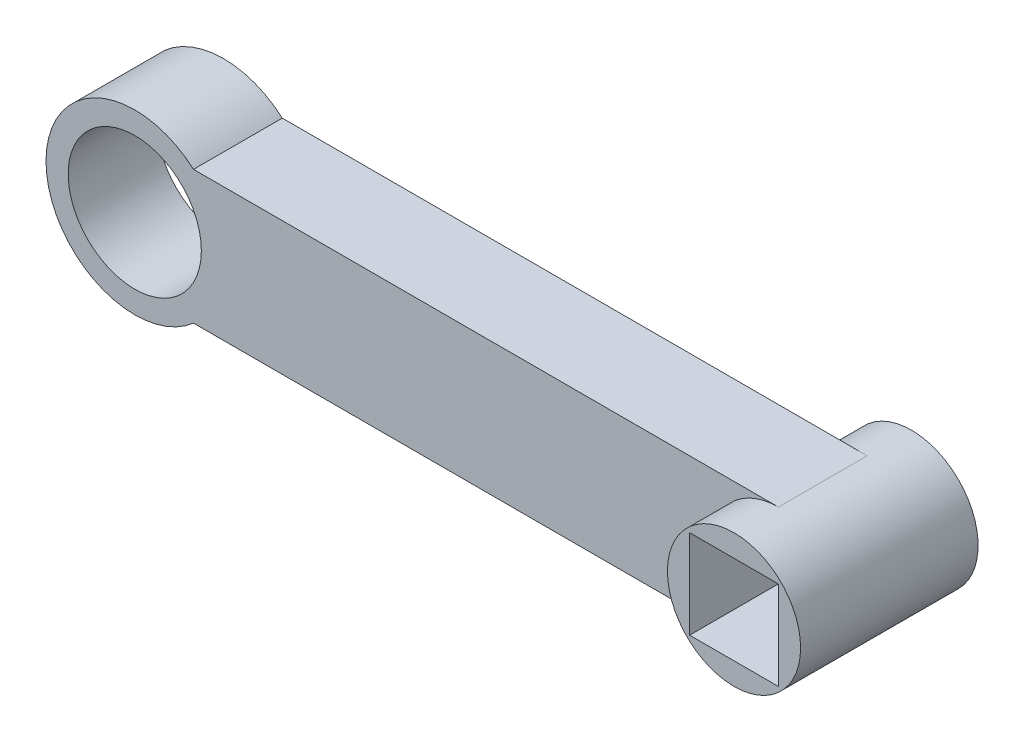
ISO-10303-21;
HEADER;
FILE_DESCRIPTION(('STEP AP214'),'2;1');
FILE_NAME('part.step','',(''),(''),'','','');
FILE_SCHEMA(('AUTOMOTIVE_DESIGN { 1 0 10303 214 1 1 1 1 }'));
ENDSEC;
DATA;
#1=APPLICATION_CONTEXT('core data for automotive mechanical design processes');
#2=APPLICATION_PROTOCOL_DEFINITION('international standard','automotive_design',2000,#1);
#3=PRODUCT_CONTEXT('',#1,'mechanical');
#4=PRODUCT('Part','Part','',(#3));
#5=PRODUCT_RELATED_PRODUCT_CATEGORY('part','',(#4));
#6=PRODUCT_DEFINITION_FORMATION('','',#4);
#7=PRODUCT_DEFINITION_CONTEXT('part definition',#1,'design');
#8=PRODUCT_DEFINITION('design','',#6,#7);
#9=PRODUCT_DEFINITION_SHAPE('','',#8);
#10=(LENGTH_UNIT() NAMED_UNIT(*) SI_UNIT(.MILLI.,.METRE.));
#11=(NAMED_UNIT(*) PLANE_ANGLE_UNIT() SI_UNIT($,.RADIAN.));
#12=(NAMED_UNIT(*) SI_UNIT($,.STERADIAN.) SOLID_ANGLE_UNIT());
#13=UNCERTAINTY_MEASURE_WITH_UNIT(LENGTH_MEASURE(1.E-05),#10,'distance_accuracy_value','');
#14=(GEOMETRIC_REPRESENTATION_CONTEXT(3) GLOBAL_UNCERTAINTY_ASSIGNED_CONTEXT((#13)) GLOBAL_UNIT_ASSIGNED_CONTEXT((#10,
#11,#12)) REPRESENTATION_CONTEXT('',''));
#15=CARTESIAN_POINT('',(0.,0.,0.));
#16=DIRECTION('',(0.,0.,1.));
#17=DIRECTION('',(1.,0.,0.));
#18=AXIS2_PLACEMENT_3D('',#15,#16,#17);
#19=CARTESIAN_POINT('',(72.5,0.,0.));
#20=DIRECTION('',(0.,0.,1.));
#21=DIRECTION('',(1.,0.,0.));
#22=AXIS2_PLACEMENT_3D('',#19,#20,#21);
#23=PLANE('',#22);
#24=CARTESIAN_POINT('',(-72.5,0.,0.));
#25=DIRECTION('',(0.,0.,1.));
#26=DIRECTION('',(1.,0.,0.));
#27=AXIS2_PLACEMENT_3D('',#24,#25,#26);
#28=CIRCLE('',#27,15.);
#29=CARTESIAN_POINT('',(-57.5,0.,0.));
#30=VERTEX_POINT('',#29);
#31=EDGE_CURVE('E146',#30,#30,#28,.T.);
#32=ORIENTED_EDGE('',*,*,#31,.T.);
#33=EDGE_LOOP('',(#32));
#34=FACE_BOUND('',#33,.T.);
#35=CARTESIAN_POINT('',(72.5,0.,0.));
#36=DIRECTION('',(0.,0.,-1.));
#37=DIRECTION('',(-1.,0.,0.));
#38=AXIS2_PLACEMENT_3D('',#35,#36,#37);
#39=CIRCLE('',#38,15.);
#40=CARTESIAN_POINT('',(72.5,-15.,0.));
#41=VERTEX_POINT('',#40);
#42=CARTESIAN_POINT('',(72.5,15.,0.));
#43=VERTEX_POINT('',#42);
#44=EDGE_CURVE('E11',#41,#43,#39,.T.);
#45=ORIENTED_EDGE('',*,*,#44,.F.);
#46=DIRECTION('',(1.,0.,0.));
#47=VECTOR('',#46,1.);
#48=CARTESIAN_POINT('',(72.5,-15.,0.));
#49=LINE('',#48,#47);
#50=CARTESIAN_POINT('',(-59.271243444677,-15.,0.));
#51=VERTEX_POINT('',#50);
#52=EDGE_CURVE('E163',#51,#41,#49,.T.);
#53=ORIENTED_EDGE('',*,*,#52,.F.);
#54=CARTESIAN_POINT('',(-72.5,0.,0.));
#55=DIRECTION('',(0.,0.,1.));
#56=DIRECTION('',(1.,0.,0.));
#57=AXIS2_PLACEMENT_3D('',#54,#55,#56);
#58=CIRCLE('',#57,20.);
#59=CARTESIAN_POINT('',(-59.271243444677,15.,0.));
#60=VERTEX_POINT('',#59);
#61=EDGE_CURVE('E182',#60,#51,#58,.T.);
#62=ORIENTED_EDGE('',*,*,#61,.F.);
#63=DIRECTION('',(-1.,0.,0.));
#64=VECTOR('',#63,1.);
#65=CARTESIAN_POINT('',(72.5,15.,0.));
#66=LINE('',#65,#64);
#67=EDGE_CURVE('E178',#43,#60,#66,.T.);
#68=ORIENTED_EDGE('',*,*,#67,.F.);
#69=EDGE_LOOP('',(#45,#53,#62,#68));
#70=FACE_BOUND('',#69,.T.);
#71=ADVANCED_FACE('F37',(#34,#70),#23,.F.);
#72=CARTESIAN_POINT('',(72.5,0.,20.));
#73=DIRECTION('',(0.,0.,1.));
#74=DIRECTION('',(1.,0.,0.));
#75=AXIS2_PLACEMENT_3D('',#72,#73,#74);
#76=PLANE('',#75);
#77=CARTESIAN_POINT('',(72.5,0.,20.));
#78=DIRECTION('',(0.,0.,1.));
#79=DIRECTION('',(1.,0.,0.));
#80=AXIS2_PLACEMENT_3D('',#77,#78,#79);
#81=CIRCLE('',#80,15.);
#82=CARTESIAN_POINT('',(72.5,15.,20.));
#83=VERTEX_POINT('',#82);
#84=CARTESIAN_POINT('',(72.5,-15.,20.));
#85=VERTEX_POINT('',#84);
#86=EDGE_CURVE('E142',#83,#85,#81,.T.);
#87=ORIENTED_EDGE('',*,*,#86,.F.);
#88=DIRECTION('',(-1.,0.,0.));
#89=VECTOR('',#88,1.);
#90=CARTESIAN_POINT('',(72.5,15.,20.));
#91=LINE('',#90,#89);
#92=CARTESIAN_POINT('',(-59.271243444677,15.,20.));
#93=VERTEX_POINT('',#92);
#94=EDGE_CURVE('E160',#83,#93,#91,.T.);
#95=ORIENTED_EDGE('',*,*,#94,.T.);
#96=CARTESIAN_POINT('',(-72.5,0.,20.));
#97=DIRECTION('',(0.,0.,1.));
#98=DIRECTION('',(1.,0.,0.));
#99=AXIS2_PLACEMENT_3D('',#96,#97,#98);
#100=CIRCLE('',#99,20.);
#101=CARTESIAN_POINT('',(-59.271243444677,-15.,20.));
#102=VERTEX_POINT('',#101);
#103=EDGE_CURVE('E162',#93,#102,#100,.T.);
#104=ORIENTED_EDGE('',*,*,#103,.T.);
#105=DIRECTION('',(1.,0.,0.));
#106=VECTOR('',#105,1.);
#107=CARTESIAN_POINT('',(72.5,-15.,20.));
#108=LINE('',#107,#106);
#109=EDGE_CURVE('E166',#102,#85,#108,.T.);
#110=ORIENTED_EDGE('',*,*,#109,.T.);
#111=EDGE_LOOP('',(#87,#95,#104,#110));
#112=FACE_BOUND('',#111,.T.);
#113=CARTESIAN_POINT('',(-72.5,0.,20.));
#114=DIRECTION('',(0.,0.,1.));
#115=DIRECTION('',(1.,0.,0.));
#116=AXIS2_PLACEMENT_3D('',#113,#114,#115);
#117=CIRCLE('',#116,15.);
#118=CARTESIAN_POINT('',(-57.5,0.,20.));
#119=VERTEX_POINT('',#118);
#120=EDGE_CURVE('E150',#119,#119,#117,.T.);
#121=ORIENTED_EDGE('',*,*,#120,.F.);
#122=EDGE_LOOP('',(#121));
#123=FACE_BOUND('',#122,.T.);
#124=ADVANCED_FACE('F206',(#112,#123),#76,.T.);
#125=CARTESIAN_POINT('',(72.5,0.,20.));
#126=DIRECTION('',(0.,0.,-1.));
#127=DIRECTION('',(-1.,0.,0.));
#128=AXIS2_PLACEMENT_3D('',#125,#126,#127);
#129=CYLINDRICAL_SURFACE('',#128,15.);
#130=DIRECTION('',(0.,0.,-1.));
#131=VECTOR('',#130,1.);
#132=CARTESIAN_POINT('',(72.5,-15.,20.));
#133=LINE('',#132,#131);
#134=EDGE_CURVE('E168',#85,#41,#133,.T.);
#135=ORIENTED_EDGE('',*,*,#134,.T.);
#136=ORIENTED_EDGE('',*,*,#44,.T.);
#137=DIRECTION('',(0.,0.,-1.));
#138=VECTOR('',#137,1.);
#139=CARTESIAN_POINT('',(72.5,15.,20.));
#140=LINE('',#139,#138);
#141=EDGE_CURVE('E46',#83,#43,#140,.T.);
#142=ORIENTED_EDGE('',*,*,#141,.F.);
#143=ORIENTED_EDGE('',*,*,#86,.T.);
#144=EDGE_LOOP('',(#135,#136,#142,#143));
#145=FACE_BOUND('',#144,.T.);
#146=CARTESIAN_POINT('',(72.5,0.,30.));
#147=DIRECTION('',(0.,0.,1.));
#148=DIRECTION('',(1.,0.,0.));
#149=AXIS2_PLACEMENT_3D('',#146,#147,#148);
#150=CIRCLE('',#149,15.);
#151=CARTESIAN_POINT('',(87.5,0.,30.));
#152=VERTEX_POINT('',#151);
#153=EDGE_CURVE('E143',#152,#152,#150,.T.);
#154=ORIENTED_EDGE('',*,*,#153,.F.);
#155=EDGE_LOOP('',(#154));
#156=FACE_BOUND('',#155,.T.);
#157=CARTESIAN_POINT('',(72.5,0.,-10.));
#158=DIRECTION('',(0.,0.,-1.));
#159=DIRECTION('',(-1.,0.,0.));
#160=AXIS2_PLACEMENT_3D('',#157,#158,#159);
#161=CIRCLE('',#160,15.);
#162=CARTESIAN_POINT('',(57.5,0.,-10.));
#163=VERTEX_POINT('',#162);
#164=EDGE_CURVE('E139',#163,#163,#161,.T.);
#165=ORIENTED_EDGE('',*,*,#164,.F.);
#166=EDGE_LOOP('',(#165));
#167=FACE_BOUND('',#166,.T.);
#168=ADVANCED_FACE('F39',(#145,#156,#167),#129,.T.);
#169=CARTESIAN_POINT('',(72.5,15.,20.));
#170=DIRECTION('',(0.,-1.,0.));
#171=DIRECTION('',(1.,0.,0.));
#172=AXIS2_PLACEMENT_3D('',#169,#170,#171);
#173=PLANE('',#172);
#174=ORIENTED_EDGE('',*,*,#67,.T.);
#175=DIRECTION('',(0.,0.,-1.));
#176=VECTOR('',#175,1.);
#177=CARTESIAN_POINT('',(-59.271243444677,15.,20.));
#178=LINE('',#177,#176);
#179=EDGE_CURVE('E155',#93,#60,#178,.T.);
#180=ORIENTED_EDGE('',*,*,#179,.F.);
#181=ORIENTED_EDGE('',*,*,#94,.F.);
#182=ORIENTED_EDGE('',*,*,#141,.T.);
#183=EDGE_LOOP('',(#174,#180,#181,#182));
#184=FACE_BOUND('',#183,.T.);
#185=ADVANCED_FACE('F208',(#184),#173,.F.);
#186=CARTESIAN_POINT('',(-72.5,0.,20.));
#187=DIRECTION('',(0.,0.,-1.));
#188=DIRECTION('',(-1.,0.,0.));
#189=AXIS2_PLACEMENT_3D('',#186,#187,#188);
#190=CYLINDRICAL_SURFACE('',#189,20.);
#191=ORIENTED_EDGE('',*,*,#61,.T.);
#192=DIRECTION('',(0.,0.,-1.));
#193=VECTOR('',#192,1.);
#194=CARTESIAN_POINT('',(-59.271243444677,-15.,20.));
#195=LINE('',#194,#193);
#196=EDGE_CURVE('E173',#102,#51,#195,.T.);
#197=ORIENTED_EDGE('',*,*,#196,.F.);
#198=ORIENTED_EDGE('',*,*,#103,.F.);
#199=ORIENTED_EDGE('',*,*,#179,.T.);
#200=EDGE_LOOP('',(#191,#197,#198,#199));
#201=FACE_BOUND('',#200,.T.);
#202=ADVANCED_FACE('F196',(#201),#190,.T.);
#203=CARTESIAN_POINT('',(72.5,-15.,20.));
#204=DIRECTION('',(0.,1.,0.));
#205=DIRECTION('',(-1.,0.,0.));
#206=AXIS2_PLACEMENT_3D('',#203,#204,#205);
#207=PLANE('',#206);
#208=ORIENTED_EDGE('',*,*,#52,.T.);
#209=ORIENTED_EDGE('',*,*,#134,.F.);
#210=ORIENTED_EDGE('',*,*,#109,.F.);
#211=ORIENTED_EDGE('',*,*,#196,.T.);
#212=EDGE_LOOP('',(#208,#209,#210,#211));
#213=FACE_BOUND('',#212,.T.);
#214=ADVANCED_FACE('F204',(#213),#207,.F.);
#215=CARTESIAN_POINT('',(-72.5,0.,20.));
#216=DIRECTION('',(0.,0.,-1.));
#217=DIRECTION('',(-1.,0.,0.));
#218=AXIS2_PLACEMENT_3D('',#215,#216,#217);
#219=CYLINDRICAL_SURFACE('',#218,15.);
#220=ORIENTED_EDGE('',*,*,#120,.T.);
#221=EDGE_LOOP('',(#220));
#222=FACE_BOUND('',#221,.T.);
#223=ORIENTED_EDGE('',*,*,#31,.F.);
#224=EDGE_LOOP('',(#223));
#225=FACE_BOUND('',#224,.T.);
#226=ADVANCED_FACE('F226',(#222,#225),#219,.F.);
#227=CARTESIAN_POINT('',(72.5,0.,30.));
#228=DIRECTION('',(0.,0.,1.));
#229=DIRECTION('',(1.,0.,0.));
#230=AXIS2_PLACEMENT_3D('',#227,#228,#229);
#231=PLANE('',#230);
#232=DIRECTION('',(0.,1.,0.));
#233=VECTOR('',#232,1.);
#234=CARTESIAN_POINT('',(82.5,0.,30.));
#235=LINE('',#234,#233);
#236=CARTESIAN_POINT('',(82.5,-10.,30.));
#237=VERTEX_POINT('',#236);
#238=CARTESIAN_POINT('',(82.5,9.99999999999999,30.));
#239=VERTEX_POINT('',#238);
#240=EDGE_CURVE('E137',#237,#239,#235,.T.);
#241=ORIENTED_EDGE('',*,*,#240,.F.);
#242=DIRECTION('',(1.,0.,0.));
#243=VECTOR('',#242,1.);
#244=CARTESIAN_POINT('',(72.5,-10.,30.));
#245=LINE('',#244,#243);
#246=CARTESIAN_POINT('',(62.5,-10.,30.));
#247=VERTEX_POINT('',#246);
#248=EDGE_CURVE('E130',#247,#237,#245,.T.);
#249=ORIENTED_EDGE('',*,*,#248,.F.);
#250=DIRECTION('',(0.,-1.,0.));
#251=VECTOR('',#250,1.);
#252=CARTESIAN_POINT('',(62.5,0.,30.));
#253=LINE('',#252,#251);
#254=CARTESIAN_POINT('',(62.5,10.,30.));
#255=VERTEX_POINT('',#254);
#256=EDGE_CURVE('E110',#255,#247,#253,.T.);
#257=ORIENTED_EDGE('',*,*,#256,.F.);
#258=DIRECTION('',(-1.,0.,0.));
#259=VECTOR('',#258,1.);
#260=CARTESIAN_POINT('',(72.5,10.,30.));
#261=LINE('',#260,#259);
#262=EDGE_CURVE('E135',#239,#255,#261,.T.);
#263=ORIENTED_EDGE('',*,*,#262,.F.);
#264=EDGE_LOOP('',(#241,#249,#257,#263));
#265=FACE_BOUND('',#264,.T.);
#266=ORIENTED_EDGE('',*,*,#153,.T.);
#267=EDGE_LOOP('',(#266));
#268=FACE_BOUND('',#267,.T.);
#269=ADVANCED_FACE('F230',(#265,#268),#231,.T.);
#270=CARTESIAN_POINT('',(72.5,0.,-10.));
#271=DIRECTION('',(0.,0.,-1.));
#272=DIRECTION('',(-1.,0.,0.));
#273=AXIS2_PLACEMENT_3D('',#270,#271,#272);
#274=PLANE('',#273);
#275=DIRECTION('',(0.,-1.,0.));
#276=VECTOR('',#275,1.);
#277=CARTESIAN_POINT('',(82.5,-10.,-10.));
#278=LINE('',#277,#276);
#279=CARTESIAN_POINT('',(82.5,9.99999999999999,-10.));
#280=VERTEX_POINT('',#279);
#281=CARTESIAN_POINT('',(82.5,-10.,-10.));
#282=VERTEX_POINT('',#281);
#283=EDGE_CURVE('E62',#280,#282,#278,.T.);
#284=ORIENTED_EDGE('',*,*,#283,.F.);
#285=DIRECTION('',(1.,0.,0.));
#286=VECTOR('',#285,1.);
#287=CARTESIAN_POINT('',(62.5,10.,-10.));
#288=LINE('',#287,#286);
#289=CARTESIAN_POINT('',(62.5,10.,-10.));
#290=VERTEX_POINT('',#289);
#291=EDGE_CURVE('E123',#290,#280,#288,.T.);
#292=ORIENTED_EDGE('',*,*,#291,.F.);
#293=DIRECTION('',(0.,1.,0.));
#294=VECTOR('',#293,1.);
#295=CARTESIAN_POINT('',(62.5,-10.,-10.));
#296=LINE('',#295,#294);
#297=CARTESIAN_POINT('',(62.5,-10.,-10.));
#298=VERTEX_POINT('',#297);
#299=EDGE_CURVE('E107',#298,#290,#296,.T.);
#300=ORIENTED_EDGE('',*,*,#299,.F.);
#301=DIRECTION('',(-1.,0.,0.));
#302=VECTOR('',#301,1.);
#303=CARTESIAN_POINT('',(62.5,-10.,-10.));
#304=LINE('',#303,#302);
#305=EDGE_CURVE('E116',#282,#298,#304,.T.);
#306=ORIENTED_EDGE('',*,*,#305,.F.);
#307=EDGE_LOOP('',(#284,#292,#300,#306));
#308=FACE_BOUND('',#307,.T.);
#309=ORIENTED_EDGE('',*,*,#164,.T.);
#310=EDGE_LOOP('',(#309));
#311=FACE_BOUND('',#310,.T.);
#312=ADVANCED_FACE('F120',(#308,#311),#274,.T.);
#313=CARTESIAN_POINT('',(82.5,-10.,40.));
#314=DIRECTION('',(1.,0.,0.));
#315=DIRECTION('',(0.,0.,-1.));
#316=AXIS2_PLACEMENT_3D('',#313,#314,#315);
#317=PLANE('',#316);
#318=ORIENTED_EDGE('',*,*,#240,.T.);
#319=DIRECTION('',(0.,0.,-1.));
#320=VECTOR('',#319,1.);
#321=CARTESIAN_POINT('',(82.5,9.99999999999999,40.));
#322=LINE('',#321,#320);
#323=EDGE_CURVE('E128',#239,#280,#322,.T.);
#324=ORIENTED_EDGE('',*,*,#323,.T.);
#325=ORIENTED_EDGE('',*,*,#283,.T.);
#326=DIRECTION('',(0.,0.,-1.));
#327=VECTOR('',#326,1.);
#328=CARTESIAN_POINT('',(82.5,-10.,40.));
#329=LINE('',#328,#327);
#330=EDGE_CURVE('E113',#237,#282,#329,.T.);
#331=ORIENTED_EDGE('',*,*,#330,.F.);
#332=EDGE_LOOP('',(#318,#324,#325,#331));
#333=FACE_BOUND('',#332,.T.);
#334=ADVANCED_FACE('F242',(#333),#317,.F.);
#335=CARTESIAN_POINT('',(62.5,10.,40.));
#336=DIRECTION('',(0.,1.,0.));
#337=DIRECTION('',(-1.,0.,0.));
#338=AXIS2_PLACEMENT_3D('',#335,#336,#337);
#339=PLANE('',#338);
#340=ORIENTED_EDGE('',*,*,#262,.T.);
#341=DIRECTION('',(0.,0.,-1.));
#342=VECTOR('',#341,1.);
#343=CARTESIAN_POINT('',(62.5,10.,40.));
#344=LINE('',#343,#342);
#345=EDGE_CURVE('E112',#255,#290,#344,.T.);
#346=ORIENTED_EDGE('',*,*,#345,.T.);
#347=ORIENTED_EDGE('',*,*,#291,.T.);
#348=ORIENTED_EDGE('',*,*,#323,.F.);
#349=EDGE_LOOP('',(#340,#346,#347,#348));
#350=FACE_BOUND('',#349,.T.);
#351=ADVANCED_FACE('F245',(#350),#339,.F.);
#352=CARTESIAN_POINT('',(62.5,-10.,40.));
#353=DIRECTION('',(-1.,0.,0.));
#354=DIRECTION('',(0.,0.,1.));
#355=AXIS2_PLACEMENT_3D('',#352,#353,#354);
#356=PLANE('',#355);
#357=ORIENTED_EDGE('',*,*,#256,.T.);
#358=DIRECTION('',(0.,0.,-1.));
#359=VECTOR('',#358,1.);
#360=CARTESIAN_POINT('',(62.5,-10.,40.));
#361=LINE('',#360,#359);
#362=EDGE_CURVE('E54',#247,#298,#361,.T.);
#363=ORIENTED_EDGE('',*,*,#362,.T.);
#364=ORIENTED_EDGE('',*,*,#299,.T.);
#365=ORIENTED_EDGE('',*,*,#345,.F.);
#366=EDGE_LOOP('',(#357,#363,#364,#365));
#367=FACE_BOUND('',#366,.T.);
#368=ADVANCED_FACE('F104',(#367),#356,.F.);
#369=CARTESIAN_POINT('',(62.5,-10.,40.));
#370=DIRECTION('',(0.,-1.,0.));
#371=DIRECTION('',(1.,0.,0.));
#372=AXIS2_PLACEMENT_3D('',#369,#370,#371);
#373=PLANE('',#372);
#374=ORIENTED_EDGE('',*,*,#248,.T.);
#375=ORIENTED_EDGE('',*,*,#330,.T.);
#376=ORIENTED_EDGE('',*,*,#305,.T.);
#377=ORIENTED_EDGE('',*,*,#362,.F.);
#378=EDGE_LOOP('',(#374,#375,#376,#377));
#379=FACE_BOUND('',#378,.T.);
#380=ADVANCED_FACE('F117',(#379),#373,.F.);
#381=CLOSED_SHELL('',(#71,#124,#168,#185,#202,#214,#226,#269,#312,#334,#351,#368,#380));
#382=MANIFOLD_SOLID_BREP('B2',#381);
#383=ADVANCED_BREP_SHAPE_REPRESENTATION('',(#18,#382),#14);
#384=SHAPE_DEFINITION_REPRESENTATION(#9,#383);
ENDSEC;
END-ISO-10303-21;
